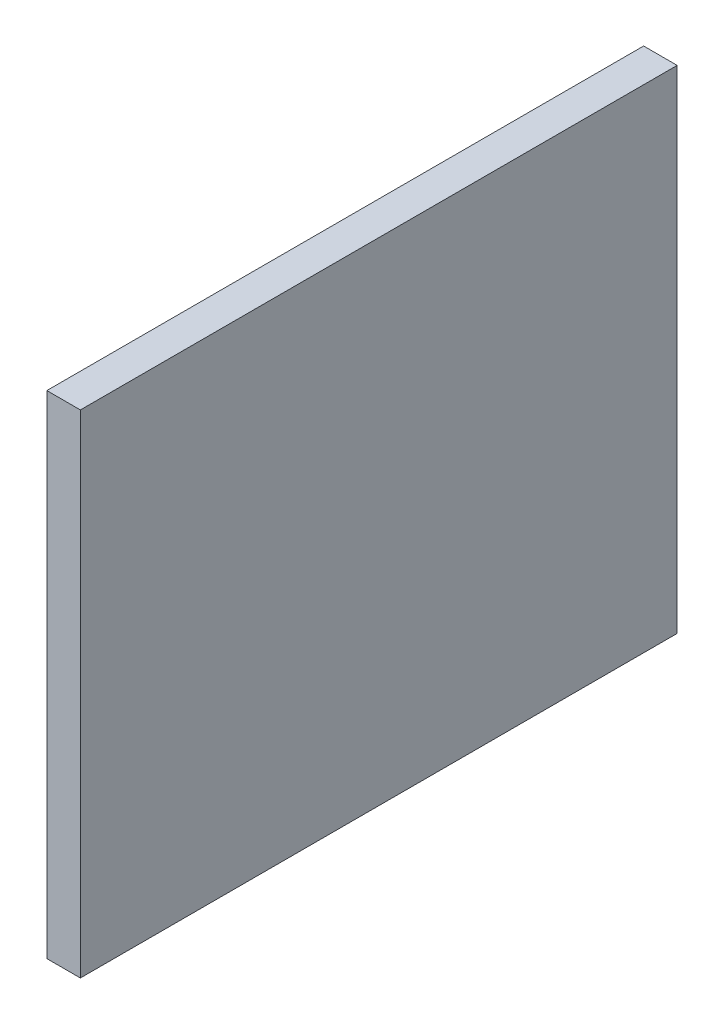
ISO-10303-21;
HEADER;
FILE_DESCRIPTION(('STEP AP214'),'2;1');
FILE_NAME('part.step','',(''),(''),'','','');
FILE_SCHEMA(('AUTOMOTIVE_DESIGN { 1 0 10303 214 1 1 1 1 }'));
ENDSEC;
DATA;
#1=APPLICATION_CONTEXT('core data for automotive mechanical design processes');
#2=APPLICATION_PROTOCOL_DEFINITION('international standard','automotive_design',2000,#1);
#3=PRODUCT_CONTEXT('',#1,'mechanical');
#4=PRODUCT('Part','Part','',(#3));
#5=PRODUCT_RELATED_PRODUCT_CATEGORY('part','',(#4));
#6=PRODUCT_DEFINITION_FORMATION('','',#4);
#7=PRODUCT_DEFINITION_CONTEXT('part definition',#1,'design');
#8=PRODUCT_DEFINITION('design','',#6,#7);
#9=PRODUCT_DEFINITION_SHAPE('','',#8);
#10=(LENGTH_UNIT() NAMED_UNIT(*) SI_UNIT(.MILLI.,.METRE.));
#11=(NAMED_UNIT(*) PLANE_ANGLE_UNIT() SI_UNIT($,.RADIAN.));
#12=(NAMED_UNIT(*) SI_UNIT($,.STERADIAN.) SOLID_ANGLE_UNIT());
#13=UNCERTAINTY_MEASURE_WITH_UNIT(LENGTH_MEASURE(1.E-05),#10,'distance_accuracy_value','');
#14=(GEOMETRIC_REPRESENTATION_CONTEXT(3) GLOBAL_UNCERTAINTY_ASSIGNED_CONTEXT((#13)) GLOBAL_UNIT_ASSIGNED_CONTEXT((#10,
#11,#12)) REPRESENTATION_CONTEXT('',''));
#15=CARTESIAN_POINT('',(0.,0.,0.));
#16=DIRECTION('',(0.,0.,1.));
#17=DIRECTION('',(1.,0.,0.));
#18=AXIS2_PLACEMENT_3D('',#15,#16,#17);
#19=CARTESIAN_POINT('',(0.,1117.6,0.));
#20=DIRECTION('',(1.,0.,0.));
#21=DIRECTION('',(0.,0.,-1.));
#22=AXIS2_PLACEMENT_3D('',#19,#20,#21);
#23=PLANE('',#22);
#24=DIRECTION('',(0.,0.,1.));
#25=VECTOR('',#24,1.);
#26=CARTESIAN_POINT('',(0.,0.,0.));
#27=LINE('',#26,#25);
#28=CARTESIAN_POINT('',(0.,0.,0.));
#29=VERTEX_POINT('',#28);
#30=CARTESIAN_POINT('',(1.66028428177405E-13,0.,1355.725));
#31=VERTEX_POINT('',#30);
#32=EDGE_CURVE('E97',#29,#31,#27,.T.);
#33=ORIENTED_EDGE('',*,*,#32,.T.);
#34=DIRECTION('',(0.,-1.,0.));
#35=VECTOR('',#34,1.);
#36=CARTESIAN_POINT('',(1.66028428177405E-13,1117.6,1355.725));
#37=LINE('',#36,#35);
#38=CARTESIAN_POINT('',(1.66028428177405E-13,1117.6,1355.725));
#39=VERTEX_POINT('',#38);
#40=EDGE_CURVE('E11',#39,#31,#37,.T.);
#41=ORIENTED_EDGE('',*,*,#40,.F.);
#42=DIRECTION('',(0.,0.,1.));
#43=VECTOR('',#42,1.);
#44=CARTESIAN_POINT('',(0.,1117.6,0.));
#45=LINE('',#44,#43);
#46=CARTESIAN_POINT('',(0.,1117.6,0.));
#47=VERTEX_POINT('',#46);
#48=EDGE_CURVE('E85',#47,#39,#45,.T.);
#49=ORIENTED_EDGE('',*,*,#48,.F.);
#50=DIRECTION('',(0.,-1.,0.));
#51=VECTOR('',#50,1.);
#52=CARTESIAN_POINT('',(0.,1117.6,0.));
#53=LINE('',#52,#51);
#54=EDGE_CURVE('E93',#47,#29,#53,.T.);
#55=ORIENTED_EDGE('',*,*,#54,.T.);
#56=EDGE_LOOP('',(#33,#41,#49,#55));
#57=FACE_BOUND('',#56,.T.);
#58=ADVANCED_FACE('F34',(#57),#23,.F.);
#59=CARTESIAN_POINT('',(1.66028428177405E-13,1117.6,1355.725));
#60=DIRECTION('',(0.,0.,-1.));
#61=DIRECTION('',(-1.,0.,0.));
#62=AXIS2_PLACEMENT_3D('',#59,#60,#61);
#63=PLANE('',#62);
#64=DIRECTION('',(1.,0.,0.));
#65=VECTOR('',#64,1.);
#66=CARTESIAN_POINT('',(1.66028428177405E-13,0.,1355.725));
#67=LINE('',#66,#65);
#68=CARTESIAN_POINT('',(76.2000000000002,0.,1355.725));
#69=VERTEX_POINT('',#68);
#70=EDGE_CURVE('E89',#31,#69,#67,.T.);
#71=ORIENTED_EDGE('',*,*,#70,.T.);
#72=DIRECTION('',(0.,-1.,0.));
#73=VECTOR('',#72,1.);
#74=CARTESIAN_POINT('',(76.2000000000002,1117.6,1355.725));
#75=LINE('',#74,#73);
#76=CARTESIAN_POINT('',(76.2000000000002,1117.6,1355.725));
#77=VERTEX_POINT('',#76);
#78=EDGE_CURVE('E42',#77,#69,#75,.T.);
#79=ORIENTED_EDGE('',*,*,#78,.F.);
#80=DIRECTION('',(1.,0.,0.));
#81=VECTOR('',#80,1.);
#82=CARTESIAN_POINT('',(1.66028428177405E-13,1117.6,1355.725));
#83=LINE('',#82,#81);
#84=EDGE_CURVE('E80',#39,#77,#83,.T.);
#85=ORIENTED_EDGE('',*,*,#84,.F.);
#86=ORIENTED_EDGE('',*,*,#40,.T.);
#87=EDGE_LOOP('',(#71,#79,#85,#86));
#88=FACE_BOUND('',#87,.T.);
#89=ADVANCED_FACE('F88',(#88),#63,.F.);
#90=CARTESIAN_POINT('',(76.2,1117.6,0.));
#91=DIRECTION('',(-1.,0.,0.));
#92=DIRECTION('',(0.,0.,1.));
#93=AXIS2_PLACEMENT_3D('',#90,#91,#92);
#94=PLANE('',#93);
#95=DIRECTION('',(0.,0.,-1.));
#96=VECTOR('',#95,1.);
#97=CARTESIAN_POINT('',(76.2,0.,0.));
#98=LINE('',#97,#96);
#99=CARTESIAN_POINT('',(76.2,0.,0.));
#100=VERTEX_POINT('',#99);
#101=EDGE_CURVE('E67',#69,#100,#98,.T.);
#102=ORIENTED_EDGE('',*,*,#101,.T.);
#103=DIRECTION('',(0.,-1.,0.));
#104=VECTOR('',#103,1.);
#105=CARTESIAN_POINT('',(76.2,1117.6,0.));
#106=LINE('',#105,#104);
#107=CARTESIAN_POINT('',(76.2,1117.6,0.));
#108=VERTEX_POINT('',#107);
#109=EDGE_CURVE('E90',#108,#100,#106,.T.);
#110=ORIENTED_EDGE('',*,*,#109,.F.);
#111=DIRECTION('',(0.,0.,-1.));
#112=VECTOR('',#111,1.);
#113=CARTESIAN_POINT('',(76.2,1117.6,0.));
#114=LINE('',#113,#112);
#115=EDGE_CURVE('E83',#77,#108,#114,.T.);
#116=ORIENTED_EDGE('',*,*,#115,.F.);
#117=ORIENTED_EDGE('',*,*,#78,.T.);
#118=EDGE_LOOP('',(#102,#110,#116,#117));
#119=FACE_BOUND('',#118,.T.);
#120=ADVANCED_FACE('F91',(#119),#94,.F.);
#121=CARTESIAN_POINT('',(0.,1117.6,0.));
#122=DIRECTION('',(0.,0.,1.));
#123=DIRECTION('',(1.,0.,0.));
#124=AXIS2_PLACEMENT_3D('',#121,#122,#123);
#125=PLANE('',#124);
#126=DIRECTION('',(-1.,0.,0.));
#127=VECTOR('',#126,1.);
#128=CARTESIAN_POINT('',(0.,0.,0.));
#129=LINE('',#128,#127);
#130=EDGE_CURVE('E73',#100,#29,#129,.T.);
#131=ORIENTED_EDGE('',*,*,#130,.T.);
#132=ORIENTED_EDGE('',*,*,#54,.F.);
#133=DIRECTION('',(-1.,0.,0.));
#134=VECTOR('',#133,1.);
#135=CARTESIAN_POINT('',(0.,1117.6,0.));
#136=LINE('',#135,#134);
#137=EDGE_CURVE('E50',#108,#47,#136,.T.);
#138=ORIENTED_EDGE('',*,*,#137,.F.);
#139=ORIENTED_EDGE('',*,*,#109,.T.);
#140=EDGE_LOOP('',(#131,#132,#138,#139));
#141=FACE_BOUND('',#140,.T.);
#142=ADVANCED_FACE('F104',(#141),#125,.F.);
#143=CARTESIAN_POINT('',(0.,1117.6,0.));
#144=DIRECTION('',(0.,1.,0.));
#145=DIRECTION('',(0.,0.,1.));
#146=AXIS2_PLACEMENT_3D('',#143,#144,#145);
#147=PLANE('',#146);
#148=ORIENTED_EDGE('',*,*,#48,.T.);
#149=ORIENTED_EDGE('',*,*,#84,.T.);
#150=ORIENTED_EDGE('',*,*,#115,.T.);
#151=ORIENTED_EDGE('',*,*,#137,.T.);
#152=EDGE_LOOP('',(#148,#149,#150,#151));
#153=FACE_BOUND('',#152,.T.);
#154=ADVANCED_FACE('F81',(#153),#147,.T.);
#155=CARTESIAN_POINT('',(0.,0.,0.));
#156=DIRECTION('',(0.,1.,0.));
#157=DIRECTION('',(0.,0.,1.));
#158=AXIS2_PLACEMENT_3D('',#155,#156,#157);
#159=PLANE('',#158);
#160=ORIENTED_EDGE('',*,*,#32,.F.);
#161=ORIENTED_EDGE('',*,*,#130,.F.);
#162=ORIENTED_EDGE('',*,*,#101,.F.);
#163=ORIENTED_EDGE('',*,*,#70,.F.);
#164=EDGE_LOOP('',(#160,#161,#162,#163));
#165=FACE_BOUND('',#164,.T.);
#166=ADVANCED_FACE('F107',(#165),#159,.F.);
#167=CLOSED_SHELL('',(#58,#89,#120,#142,#154,#166));
#168=MANIFOLD_SOLID_BREP('B2',#167);
#169=ADVANCED_BREP_SHAPE_REPRESENTATION('',(#18,#168),#14);
#170=SHAPE_DEFINITION_REPRESENTATION(#9,#169);
ENDSEC;
END-ISO-10303-21;
